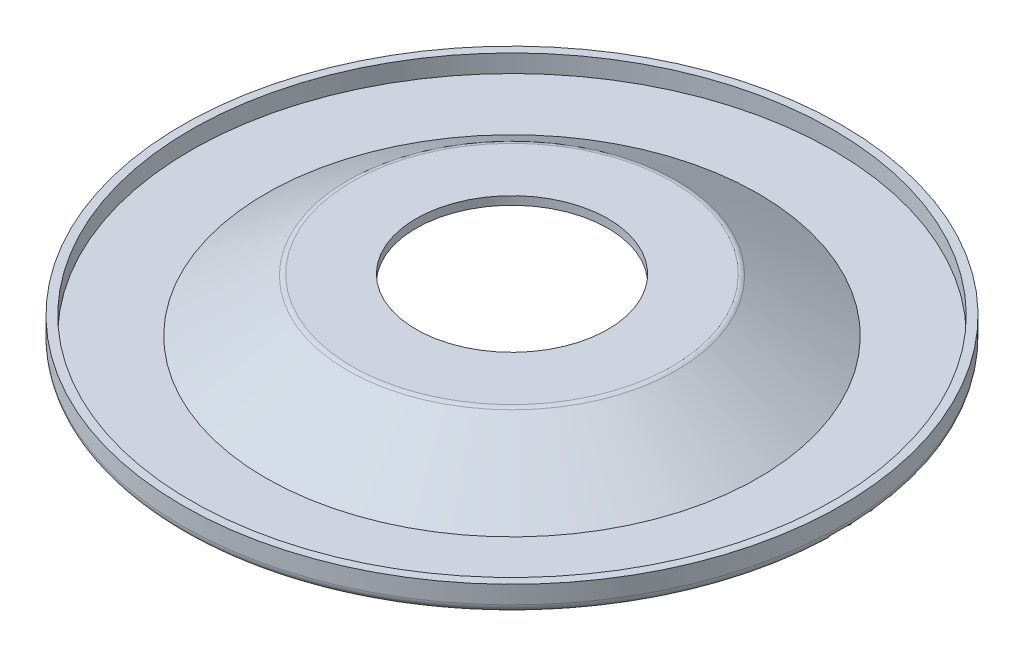
ISO-10303-21;
HEADER;
FILE_DESCRIPTION(('STEP AP214'),'2;1');
FILE_NAME('part.step','',(''),(''),'','','');
FILE_SCHEMA(('AUTOMOTIVE_DESIGN { 1 0 10303 214 1 1 1 1 }'));
ENDSEC;
DATA;
#1=APPLICATION_CONTEXT('core data for automotive mechanical design processes');
#2=APPLICATION_PROTOCOL_DEFINITION('international standard','automotive_design',2000,#1);
#3=PRODUCT_CONTEXT('',#1,'mechanical');
#4=PRODUCT('Part','Part','',(#3));
#5=PRODUCT_RELATED_PRODUCT_CATEGORY('part','',(#4));
#6=PRODUCT_DEFINITION_FORMATION('','',#4);
#7=PRODUCT_DEFINITION_CONTEXT('part definition',#1,'design');
#8=PRODUCT_DEFINITION('design','',#6,#7);
#9=PRODUCT_DEFINITION_SHAPE('','',#8);
#10=(LENGTH_UNIT() NAMED_UNIT(*) SI_UNIT(.MILLI.,.METRE.));
#11=(NAMED_UNIT(*) PLANE_ANGLE_UNIT() SI_UNIT($,.RADIAN.));
#12=(NAMED_UNIT(*) SI_UNIT($,.STERADIAN.) SOLID_ANGLE_UNIT());
#13=UNCERTAINTY_MEASURE_WITH_UNIT(LENGTH_MEASURE(1.E-05),#10,'distance_accuracy_value','');
#14=(GEOMETRIC_REPRESENTATION_CONTEXT(3) GLOBAL_UNCERTAINTY_ASSIGNED_CONTEXT((#13)) GLOBAL_UNIT_ASSIGNED_CONTEXT((#10,
#11,#12)) REPRESENTATION_CONTEXT('',''));
#15=CARTESIAN_POINT('',(0.,0.,0.));
#16=DIRECTION('',(0.,0.,1.));
#17=DIRECTION('',(1.,0.,0.));
#18=AXIS2_PLACEMENT_3D('',#15,#16,#17);
#19=CARTESIAN_POINT('',(0.,-0.699999999999978,0.));
#20=DIRECTION('',(0.,-1.,0.));
#21=DIRECTION('',(0.,0.,-1.));
#22=AXIS2_PLACEMENT_3D('',#19,#20,#21);
#23=TOROIDAL_SURFACE('',#22,13.45,0.7);
#24=CARTESIAN_POINT('',(0.,-0.110062878447725,0.));
#25=DIRECTION('',(0.,-1.,0.));
#26=DIRECTION('',(0.,0.,-1.));
#27=AXIS2_PLACEMENT_3D('',#24,#25,#26);
#28=CIRCLE('',#27,13.8267946292274);
#29=CARTESIAN_POINT('',(0.,-0.110062878447725,-13.8267946292274));
#30=VERTEX_POINT('',#29);
#31=EDGE_CURVE('E10',#30,#30,#28,.T.);
#32=ORIENTED_EDGE('',*,*,#31,.F.);
#33=EDGE_LOOP('',(#32));
#34=FACE_BOUND('',#33,.T.);
#35=CARTESIAN_POINT('',(0.,0.,0.));
#36=DIRECTION('',(0.,-1.,0.));
#37=DIRECTION('',(0.,0.,-1.));
#38=AXIS2_PLACEMENT_3D('',#35,#36,#37);
#39=CIRCLE('',#38,13.45);
#40=CARTESIAN_POINT('',(0.,0.,-13.45));
#41=VERTEX_POINT('',#40);
#42=EDGE_CURVE('E76',#41,#41,#39,.T.);
#43=ORIENTED_EDGE('',*,*,#42,.T.);
#44=EDGE_LOOP('',(#43));
#45=FACE_BOUND('',#44,.T.);
#46=ADVANCED_FACE('F33',(#34,#45),#23,.T.);
#47=CARTESIAN_POINT('',(0.,-0.110062878447725,0.));
#48=DIRECTION('',(0.,-1.,0.));
#49=DIRECTION('',(0.,0.,-1.));
#50=AXIS2_PLACEMENT_3D('',#47,#48,#49);
#51=CONICAL_SURFACE('',#50,13.8267946292274,1.00240377283717);
#52=CARTESIAN_POINT('',(0.,-4.50000000000001,0.));
#53=DIRECTION('',(0.,-1.,0.));
#54=DIRECTION('',(0.,0.,-1.));
#55=AXIS2_PLACEMENT_3D('',#52,#53,#54);
#56=CIRCLE('',#55,20.7);
#57=CARTESIAN_POINT('',(0.,-4.50000000000001,-20.7));
#58=VERTEX_POINT('',#57);
#59=EDGE_CURVE('E39',#58,#58,#56,.T.);
#60=ORIENTED_EDGE('',*,*,#59,.F.);
#61=EDGE_LOOP('',(#60));
#62=FACE_BOUND('',#61,.T.);
#63=ORIENTED_EDGE('',*,*,#31,.T.);
#64=EDGE_LOOP('',(#63));
#65=FACE_BOUND('',#64,.T.);
#66=ADVANCED_FACE('F143',(#62,#65),#51,.T.);
#67=CARTESIAN_POINT('',(-20.7,-4.50000000000001,0.));
#68=DIRECTION('',(0.,-1.,0.));
#69=DIRECTION('',(0.,0.,-1.));
#70=AXIS2_PLACEMENT_3D('',#67,#68,#69);
#71=PLANE('',#70);
#72=CARTESIAN_POINT('',(0.,-4.50000000000001,0.));
#73=DIRECTION('',(0.,-1.,0.));
#74=DIRECTION('',(0.,0.,-1.));
#75=AXIS2_PLACEMENT_3D('',#72,#73,#74);
#76=CIRCLE('',#75,27.);
#77=CARTESIAN_POINT('',(0.,-4.50000000000001,-27.));
#78=VERTEX_POINT('',#77);
#79=EDGE_CURVE('E43',#78,#78,#76,.T.);
#80=ORIENTED_EDGE('',*,*,#79,.F.);
#81=EDGE_LOOP('',(#80));
#82=FACE_BOUND('',#81,.T.);
#83=ORIENTED_EDGE('',*,*,#59,.T.);
#84=EDGE_LOOP('',(#83));
#85=FACE_BOUND('',#84,.T.);
#86=ADVANCED_FACE('F138',(#82,#85),#71,.F.);
#87=CARTESIAN_POINT('',(0.,0.,0.));
#88=DIRECTION('',(0.,-1.,0.));
#89=DIRECTION('',(0.,0.,-1.));
#90=AXIS2_PLACEMENT_3D('',#87,#88,#89);
#91=CYLINDRICAL_SURFACE('',#90,27.);
#92=CARTESIAN_POINT('',(0.,-3.,0.));
#93=DIRECTION('',(0.,-1.,0.));
#94=DIRECTION('',(0.,0.,-1.));
#95=AXIS2_PLACEMENT_3D('',#92,#93,#94);
#96=CIRCLE('',#95,27.);
#97=CARTESIAN_POINT('',(0.,-3.,-27.));
#98=VERTEX_POINT('',#97);
#99=EDGE_CURVE('E47',#98,#98,#96,.T.);
#100=ORIENTED_EDGE('',*,*,#99,.F.);
#101=EDGE_LOOP('',(#100));
#102=FACE_BOUND('',#101,.T.);
#103=ORIENTED_EDGE('',*,*,#79,.T.);
#104=EDGE_LOOP('',(#103));
#105=FACE_BOUND('',#104,.T.);
#106=ADVANCED_FACE('F132',(#102,#105),#91,.F.);
#107=CARTESIAN_POINT('',(-27.,-3.,0.));
#108=DIRECTION('',(0.,-1.,0.));
#109=DIRECTION('',(0.,0.,-1.));
#110=AXIS2_PLACEMENT_3D('',#107,#108,#109);
#111=PLANE('',#110);
#112=CARTESIAN_POINT('',(0.,-3.,0.));
#113=DIRECTION('',(0.,-1.,0.));
#114=DIRECTION('',(0.,0.,-1.));
#115=AXIS2_PLACEMENT_3D('',#112,#113,#114);
#116=CIRCLE('',#115,27.7);
#117=CARTESIAN_POINT('',(0.,-3.,-27.7));
#118=VERTEX_POINT('',#117);
#119=EDGE_CURVE('E52',#118,#118,#116,.T.);
#120=ORIENTED_EDGE('',*,*,#119,.F.);
#121=EDGE_LOOP('',(#120));
#122=FACE_BOUND('',#121,.T.);
#123=ORIENTED_EDGE('',*,*,#99,.T.);
#124=EDGE_LOOP('',(#123));
#125=FACE_BOUND('',#124,.T.);
#126=ADVANCED_FACE('F126',(#122,#125),#111,.F.);
#127=CARTESIAN_POINT('',(0.,0.,0.));
#128=DIRECTION('',(0.,-1.,0.));
#129=DIRECTION('',(0.,0.,-1.));
#130=AXIS2_PLACEMENT_3D('',#127,#128,#129);
#131=CYLINDRICAL_SURFACE('',#130,27.7);
#132=CARTESIAN_POINT('',(0.,-4.50000000000001,0.));
#133=DIRECTION('',(0.,-1.,0.));
#134=DIRECTION('',(0.,0.,-1.));
#135=AXIS2_PLACEMENT_3D('',#132,#133,#134);
#136=CIRCLE('',#135,27.7);
#137=CARTESIAN_POINT('',(0.,-4.50000000000001,-27.7));
#138=VERTEX_POINT('',#137);
#139=EDGE_CURVE('E55',#138,#138,#136,.T.);
#140=ORIENTED_EDGE('',*,*,#139,.F.);
#141=EDGE_LOOP('',(#140));
#142=FACE_BOUND('',#141,.T.);
#143=ORIENTED_EDGE('',*,*,#119,.T.);
#144=EDGE_LOOP('',(#143));
#145=FACE_BOUND('',#144,.T.);
#146=ADVANCED_FACE('F120',(#142,#145),#131,.T.);
#147=CARTESIAN_POINT('',(0.,-4.50000000000001,0.));
#148=DIRECTION('',(0.,-1.,0.));
#149=DIRECTION('',(0.,0.,-1.));
#150=AXIS2_PLACEMENT_3D('',#147,#148,#149);
#151=TOROIDAL_SURFACE('',#150,27.,0.699999999999999);
#152=CARTESIAN_POINT('',(0.,-5.19999999999999,0.));
#153=DIRECTION('',(0.,-1.,0.));
#154=DIRECTION('',(0.,0.,-1.));
#155=AXIS2_PLACEMENT_3D('',#152,#153,#154);
#156=CIRCLE('',#155,27.);
#157=CARTESIAN_POINT('',(0.,-5.19999999999999,-27.));
#158=VERTEX_POINT('',#157);
#159=EDGE_CURVE('E58',#158,#158,#156,.T.);
#160=ORIENTED_EDGE('',*,*,#159,.F.);
#161=EDGE_LOOP('',(#160));
#162=FACE_BOUND('',#161,.T.);
#163=ORIENTED_EDGE('',*,*,#139,.T.);
#164=EDGE_LOOP('',(#163));
#165=FACE_BOUND('',#164,.T.);
#166=ADVANCED_FACE('F114',(#162,#165),#151,.T.);
#167=CARTESIAN_POINT('',(-20.7,-5.19999999999999,0.));
#168=DIRECTION('',(0.,1.,0.));
#169=DIRECTION('',(0.,0.,1.));
#170=AXIS2_PLACEMENT_3D('',#167,#168,#169);
#171=PLANE('',#170);
#172=CARTESIAN_POINT('',(0.,-5.19999999999999,0.));
#173=DIRECTION('',(0.,-1.,0.));
#174=DIRECTION('',(0.,0.,-1.));
#175=AXIS2_PLACEMENT_3D('',#172,#173,#174);
#176=CIRCLE('',#175,20.7);
#177=CARTESIAN_POINT('',(0.,-5.19999999999999,-20.7));
#178=VERTEX_POINT('',#177);
#179=EDGE_CURVE('E61',#178,#178,#176,.T.);
#180=ORIENTED_EDGE('',*,*,#179,.F.);
#181=EDGE_LOOP('',(#180));
#182=FACE_BOUND('',#181,.T.);
#183=ORIENTED_EDGE('',*,*,#159,.T.);
#184=EDGE_LOOP('',(#183));
#185=FACE_BOUND('',#184,.T.);
#186=ADVANCED_FACE('F108',(#182,#185),#171,.F.);
#187=CARTESIAN_POINT('',(0.,-4.50000000000001,0.));
#188=DIRECTION('',(0.,-1.,0.));
#189=DIRECTION('',(0.,0.,-1.));
#190=AXIS2_PLACEMENT_3D('',#187,#188,#189);
#191=TOROIDAL_SURFACE('',#190,20.7,0.700000000000001);
#192=CARTESIAN_POINT('',(0.,-5.08993712155226,0.));
#193=DIRECTION('',(0.,-1.,0.));
#194=DIRECTION('',(0.,0.,-1.));
#195=AXIS2_PLACEMENT_3D('',#192,#193,#194);
#196=CIRCLE('',#195,20.3232053707726);
#197=CARTESIAN_POINT('',(0.,-5.08993712155226,-20.3232053707726));
#198=VERTEX_POINT('',#197);
#199=EDGE_CURVE('E64',#198,#198,#196,.T.);
#200=ORIENTED_EDGE('',*,*,#199,.F.);
#201=EDGE_LOOP('',(#200));
#202=FACE_BOUND('',#201,.T.);
#203=ORIENTED_EDGE('',*,*,#179,.T.);
#204=EDGE_LOOP('',(#203));
#205=FACE_BOUND('',#204,.T.);
#206=ADVANCED_FACE('F102',(#202,#205),#191,.T.);
#207=CARTESIAN_POINT('',(0.,-5.08993712155226,0.));
#208=DIRECTION('',(0.,-1.,0.));
#209=DIRECTION('',(0.,0.,-1.));
#210=AXIS2_PLACEMENT_3D('',#207,#208,#209);
#211=CONICAL_SURFACE('',#210,20.3232053707726,1.00240377283717);
#212=CARTESIAN_POINT('',(0.,-0.699999999999978,0.));
#213=DIRECTION('',(0.,-1.,0.));
#214=DIRECTION('',(0.,0.,-1.));
#215=AXIS2_PLACEMENT_3D('',#212,#213,#214);
#216=CIRCLE('',#215,13.45);
#217=CARTESIAN_POINT('',(0.,-0.699999999999978,-13.45));
#218=VERTEX_POINT('',#217);
#219=EDGE_CURVE('E67',#218,#218,#216,.T.);
#220=ORIENTED_EDGE('',*,*,#219,.F.);
#221=EDGE_LOOP('',(#220));
#222=FACE_BOUND('',#221,.T.);
#223=ORIENTED_EDGE('',*,*,#199,.T.);
#224=EDGE_LOOP('',(#223));
#225=FACE_BOUND('',#224,.T.);
#226=ADVANCED_FACE('F96',(#222,#225),#211,.F.);
#227=CARTESIAN_POINT('',(-8.065,-0.699999999999978,0.));
#228=DIRECTION('',(0.,1.,0.));
#229=DIRECTION('',(0.,0.,1.));
#230=AXIS2_PLACEMENT_3D('',#227,#228,#229);
#231=PLANE('',#230);
#232=CARTESIAN_POINT('',(0.,-0.699999999999978,0.));
#233=DIRECTION('',(0.,-1.,0.));
#234=DIRECTION('',(0.,0.,-1.));
#235=AXIS2_PLACEMENT_3D('',#232,#233,#234);
#236=CIRCLE('',#235,8.065);
#237=CARTESIAN_POINT('',(0.,-0.699999999999978,-8.065));
#238=VERTEX_POINT('',#237);
#239=EDGE_CURVE('E70',#238,#238,#236,.T.);
#240=ORIENTED_EDGE('',*,*,#239,.F.);
#241=EDGE_LOOP('',(#240));
#242=FACE_BOUND('',#241,.T.);
#243=ORIENTED_EDGE('',*,*,#219,.T.);
#244=EDGE_LOOP('',(#243));
#245=FACE_BOUND('',#244,.T.);
#246=ADVANCED_FACE('F90',(#242,#245),#231,.F.);
#247=CARTESIAN_POINT('',(0.,0.,0.));
#248=DIRECTION('',(0.,-1.,0.));
#249=DIRECTION('',(0.,0.,-1.));
#250=AXIS2_PLACEMENT_3D('',#247,#248,#249);
#251=CYLINDRICAL_SURFACE('',#250,8.065);
#252=CARTESIAN_POINT('',(0.,0.,0.));
#253=DIRECTION('',(0.,-1.,0.));
#254=DIRECTION('',(0.,0.,-1.));
#255=AXIS2_PLACEMENT_3D('',#252,#253,#254);
#256=CIRCLE('',#255,8.065);
#257=CARTESIAN_POINT('',(0.,0.,-8.065));
#258=VERTEX_POINT('',#257);
#259=EDGE_CURVE('E73',#258,#258,#256,.T.);
#260=ORIENTED_EDGE('',*,*,#259,.F.);
#261=EDGE_LOOP('',(#260));
#262=FACE_BOUND('',#261,.T.);
#263=ORIENTED_EDGE('',*,*,#239,.T.);
#264=EDGE_LOOP('',(#263));
#265=FACE_BOUND('',#264,.T.);
#266=ADVANCED_FACE('F84',(#262,#265),#251,.F.);
#267=CARTESIAN_POINT('',(-8.065,0.,0.));
#268=DIRECTION('',(0.,-1.,0.));
#269=DIRECTION('',(0.,0.,-1.));
#270=AXIS2_PLACEMENT_3D('',#267,#268,#269);
#271=PLANE('',#270);
#272=ORIENTED_EDGE('',*,*,#42,.F.);
#273=EDGE_LOOP('',(#272));
#274=FACE_BOUND('',#273,.T.);
#275=ORIENTED_EDGE('',*,*,#259,.T.);
#276=EDGE_LOOP('',(#275));
#277=FACE_BOUND('',#276,.T.);
#278=ADVANCED_FACE('F81',(#274,#277),#271,.F.);
#279=CLOSED_SHELL('',(#46,#66,#86,#106,#126,#146,#166,#186,#206,#226,#246,#266,#278));
#280=MANIFOLD_SOLID_BREP('B2',#279);
#281=ADVANCED_BREP_SHAPE_REPRESENTATION('',(#18,#280),#14);
#282=SHAPE_DEFINITION_REPRESENTATION(#9,#281);
ENDSEC;
END-ISO-10303-21;
